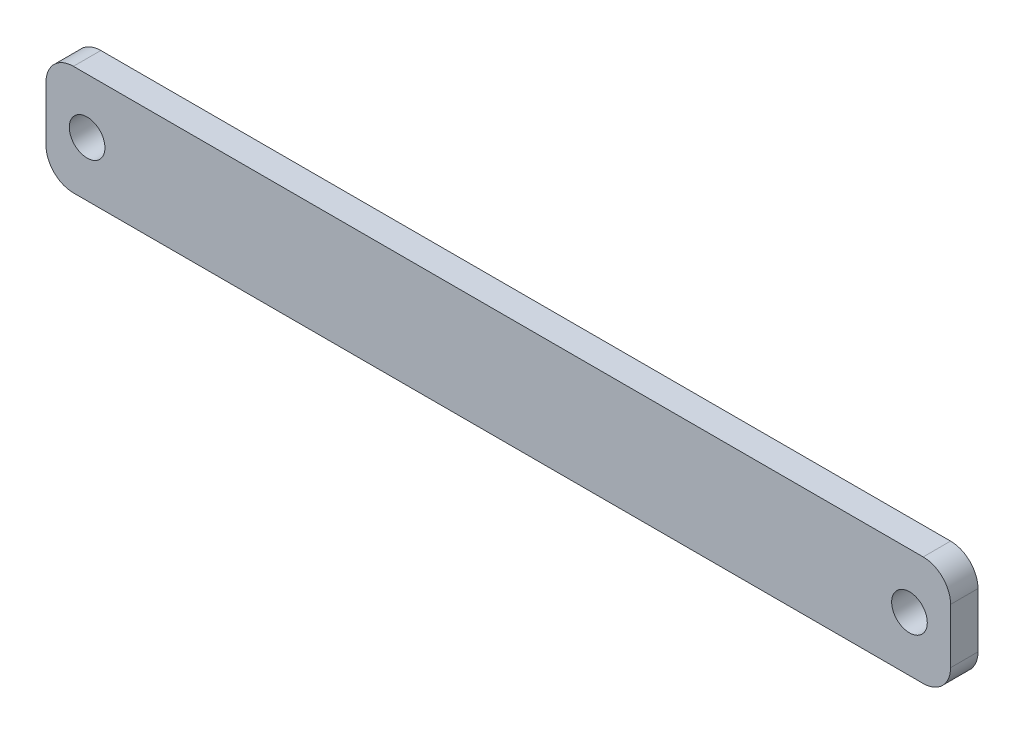
ISO-10303-21;
HEADER;
FILE_DESCRIPTION(('STEP AP214'),'2;1');
FILE_NAME('part.step','',(''),(''),'','','');
FILE_SCHEMA(('AUTOMOTIVE_DESIGN { 1 0 10303 214 1 1 1 1 }'));
ENDSEC;
DATA;
#1=APPLICATION_CONTEXT('core data for automotive mechanical design processes');
#2=APPLICATION_PROTOCOL_DEFINITION('international standard','automotive_design',2000,#1);
#3=PRODUCT_CONTEXT('',#1,'mechanical');
#4=PRODUCT('Part','Part','',(#3));
#5=PRODUCT_RELATED_PRODUCT_CATEGORY('part','',(#4));
#6=PRODUCT_DEFINITION_FORMATION('','',#4);
#7=PRODUCT_DEFINITION_CONTEXT('part definition',#1,'design');
#8=PRODUCT_DEFINITION('design','',#6,#7);
#9=PRODUCT_DEFINITION_SHAPE('','',#8);
#10=(LENGTH_UNIT() NAMED_UNIT(*) SI_UNIT(.MILLI.,.METRE.));
#11=(NAMED_UNIT(*) PLANE_ANGLE_UNIT() SI_UNIT($,.RADIAN.));
#12=(NAMED_UNIT(*) SI_UNIT($,.STERADIAN.) SOLID_ANGLE_UNIT());
#13=UNCERTAINTY_MEASURE_WITH_UNIT(LENGTH_MEASURE(1.E-05),#10,'distance_accuracy_value','');
#14=(GEOMETRIC_REPRESENTATION_CONTEXT(3) GLOBAL_UNCERTAINTY_ASSIGNED_CONTEXT((#13)) GLOBAL_UNIT_ASSIGNED_CONTEXT((#10,
#11,#12)) REPRESENTATION_CONTEXT('',''));
#15=CARTESIAN_POINT('',(0.,0.,0.));
#16=DIRECTION('',(0.,0.,1.));
#17=DIRECTION('',(1.,0.,0.));
#18=AXIS2_PLACEMENT_3D('',#15,#16,#17);
#19=CARTESIAN_POINT('',(155.,-10.,10.));
#20=DIRECTION('',(0.,0.,1.));
#21=DIRECTION('',(1.,0.,0.));
#22=AXIS2_PLACEMENT_3D('',#19,#20,#21);
#23=PLANE('',#22);
#24=CARTESIAN_POINT('',(-150.,0.,10.));
#25=DIRECTION('',(0.,0.,1.));
#26=DIRECTION('',(1.,0.,0.));
#27=AXIS2_PLACEMENT_3D('',#24,#25,#26);
#28=CIRCLE('',#27,6.50000000000002);
#29=CARTESIAN_POINT('',(-143.5,0.,10.));
#30=VERTEX_POINT('',#29);
#31=EDGE_CURVE('E136',#30,#30,#28,.T.);
#32=ORIENTED_EDGE('',*,*,#31,.F.);
#33=EDGE_LOOP('',(#32));
#34=FACE_BOUND('',#33,.T.);
#35=CARTESIAN_POINT('',(155.,-10.,10.));
#36=DIRECTION('',(0.,0.,1.));
#37=DIRECTION('',(1.,0.,0.));
#38=AXIS2_PLACEMENT_3D('',#35,#36,#37);
#39=CIRCLE('',#38,10.);
#40=CARTESIAN_POINT('',(155.,-20.,10.));
#41=VERTEX_POINT('',#40);
#42=CARTESIAN_POINT('',(165.,-9.99999999999993,10.));
#43=VERTEX_POINT('',#42);
#44=EDGE_CURVE('E147',#41,#43,#39,.T.);
#45=ORIENTED_EDGE('',*,*,#44,.T.);
#46=DIRECTION('',(0.,1.,0.));
#47=VECTOR('',#46,1.);
#48=CARTESIAN_POINT('',(165.,9.99999999999993,10.));
#49=LINE('',#48,#47);
#50=CARTESIAN_POINT('',(165.,9.99999999999993,10.));
#51=VERTEX_POINT('',#50);
#52=EDGE_CURVE('E95',#43,#51,#49,.T.);
#53=ORIENTED_EDGE('',*,*,#52,.T.);
#54=CARTESIAN_POINT('',(155.,10.,10.));
#55=DIRECTION('',(0.,0.,1.));
#56=DIRECTION('',(-1.,0.,0.));
#57=AXIS2_PLACEMENT_3D('',#54,#55,#56);
#58=CIRCLE('',#57,10.);
#59=CARTESIAN_POINT('',(155.,20.,10.));
#60=VERTEX_POINT('',#59);
#61=EDGE_CURVE('E162',#51,#60,#58,.T.);
#62=ORIENTED_EDGE('',*,*,#61,.T.);
#63=DIRECTION('',(-1.,0.,0.));
#64=VECTOR('',#63,1.);
#65=CARTESIAN_POINT('',(-155.,20.,10.));
#66=LINE('',#65,#64);
#67=CARTESIAN_POINT('',(-155.,20.,10.));
#68=VERTEX_POINT('',#67);
#69=EDGE_CURVE('E175',#60,#68,#66,.T.);
#70=ORIENTED_EDGE('',*,*,#69,.T.);
#71=CARTESIAN_POINT('',(-155.,10.,10.));
#72=DIRECTION('',(0.,0.,1.));
#73=DIRECTION('',(1.,0.,0.));
#74=AXIS2_PLACEMENT_3D('',#71,#72,#73);
#75=CIRCLE('',#74,10.);
#76=CARTESIAN_POINT('',(-165.,9.99999999999993,10.));
#77=VERTEX_POINT('',#76);
#78=EDGE_CURVE('E114',#68,#77,#75,.T.);
#79=ORIENTED_EDGE('',*,*,#78,.T.);
#80=DIRECTION('',(0.,-1.,0.));
#81=VECTOR('',#80,1.);
#82=CARTESIAN_POINT('',(-165.,9.99999999999993,10.));
#83=LINE('',#82,#81);
#84=CARTESIAN_POINT('',(-165.,-9.99999999999993,10.));
#85=VERTEX_POINT('',#84);
#86=EDGE_CURVE('E108',#77,#85,#83,.T.);
#87=ORIENTED_EDGE('',*,*,#86,.T.);
#88=CARTESIAN_POINT('',(-155.,-10.,10.));
#89=DIRECTION('',(0.,0.,1.));
#90=DIRECTION('',(1.,0.,0.));
#91=AXIS2_PLACEMENT_3D('',#88,#89,#90);
#92=CIRCLE('',#91,10.);
#93=CARTESIAN_POINT('',(-155.,-20.,10.));
#94=VERTEX_POINT('',#93);
#95=EDGE_CURVE('E112',#85,#94,#92,.T.);
#96=ORIENTED_EDGE('',*,*,#95,.T.);
#97=DIRECTION('',(1.,0.,0.));
#98=VECTOR('',#97,1.);
#99=CARTESIAN_POINT('',(-155.,-20.,10.));
#100=LINE('',#99,#98);
#101=EDGE_CURVE('E52',#94,#41,#100,.T.);
#102=ORIENTED_EDGE('',*,*,#101,.T.);
#103=EDGE_LOOP('',(#45,#53,#62,#70,#79,#87,#96,#102));
#104=FACE_BOUND('',#103,.T.);
#105=CARTESIAN_POINT('',(150.,0.,10.));
#106=DIRECTION('',(0.,0.,1.));
#107=DIRECTION('',(1.,0.,0.));
#108=AXIS2_PLACEMENT_3D('',#105,#106,#107);
#109=CIRCLE('',#108,6.50000000000002);
#110=CARTESIAN_POINT('',(156.5,0.,10.));
#111=VERTEX_POINT('',#110);
#112=EDGE_CURVE('E184',#111,#111,#109,.T.);
#113=ORIENTED_EDGE('',*,*,#112,.F.);
#114=EDGE_LOOP('',(#113));
#115=FACE_BOUND('',#114,.T.);
#116=ADVANCED_FACE('F35',(#34,#104,#115),#23,.T.);
#117=CARTESIAN_POINT('',(155.,-10.,0.));
#118=DIRECTION('',(0.,0.,1.));
#119=DIRECTION('',(1.,0.,0.));
#120=AXIS2_PLACEMENT_3D('',#117,#118,#119);
#121=PLANE('',#120);
#122=CARTESIAN_POINT('',(155.,-10.,0.));
#123=DIRECTION('',(0.,0.,1.));
#124=DIRECTION('',(1.,0.,0.));
#125=AXIS2_PLACEMENT_3D('',#122,#123,#124);
#126=CIRCLE('',#125,10.);
#127=CARTESIAN_POINT('',(155.,-20.,0.));
#128=VERTEX_POINT('',#127);
#129=CARTESIAN_POINT('',(165.,-9.99999999999993,0.));
#130=VERTEX_POINT('',#129);
#131=EDGE_CURVE('E132',#128,#130,#126,.T.);
#132=ORIENTED_EDGE('',*,*,#131,.F.);
#133=DIRECTION('',(1.,0.,0.));
#134=VECTOR('',#133,1.);
#135=CARTESIAN_POINT('',(-155.,-20.,0.));
#136=LINE('',#135,#134);
#137=CARTESIAN_POINT('',(-155.,-20.,0.));
#138=VERTEX_POINT('',#137);
#139=EDGE_CURVE('E87',#138,#128,#136,.T.);
#140=ORIENTED_EDGE('',*,*,#139,.F.);
#141=CARTESIAN_POINT('',(-155.,-10.,0.));
#142=DIRECTION('',(0.,0.,1.));
#143=DIRECTION('',(1.,0.,0.));
#144=AXIS2_PLACEMENT_3D('',#141,#142,#143);
#145=CIRCLE('',#144,10.);
#146=CARTESIAN_POINT('',(-165.,-9.99999999999993,0.));
#147=VERTEX_POINT('',#146);
#148=EDGE_CURVE('E81',#147,#138,#145,.T.);
#149=ORIENTED_EDGE('',*,*,#148,.F.);
#150=DIRECTION('',(0.,-1.,0.));
#151=VECTOR('',#150,1.);
#152=CARTESIAN_POINT('',(-165.,9.99999999999993,0.));
#153=LINE('',#152,#151);
#154=CARTESIAN_POINT('',(-165.,9.99999999999993,0.));
#155=VERTEX_POINT('',#154);
#156=EDGE_CURVE('E122',#155,#147,#153,.T.);
#157=ORIENTED_EDGE('',*,*,#156,.F.);
#158=CARTESIAN_POINT('',(-155.,10.,0.));
#159=DIRECTION('',(0.,0.,1.));
#160=DIRECTION('',(1.,0.,0.));
#161=AXIS2_PLACEMENT_3D('',#158,#159,#160);
#162=CIRCLE('',#161,10.);
#163=CARTESIAN_POINT('',(-155.,20.,0.));
#164=VERTEX_POINT('',#163);
#165=EDGE_CURVE('E142',#164,#155,#162,.T.);
#166=ORIENTED_EDGE('',*,*,#165,.F.);
#167=DIRECTION('',(-1.,0.,0.));
#168=VECTOR('',#167,1.);
#169=CARTESIAN_POINT('',(-155.,20.,0.));
#170=LINE('',#169,#168);
#171=CARTESIAN_POINT('',(155.,20.,0.));
#172=VERTEX_POINT('',#171);
#173=EDGE_CURVE('E140',#172,#164,#170,.T.);
#174=ORIENTED_EDGE('',*,*,#173,.F.);
#175=CARTESIAN_POINT('',(155.,10.,0.));
#176=DIRECTION('',(0.,0.,1.));
#177=DIRECTION('',(-1.,0.,0.));
#178=AXIS2_PLACEMENT_3D('',#175,#176,#177);
#179=CIRCLE('',#178,10.);
#180=CARTESIAN_POINT('',(165.,9.99999999999993,0.));
#181=VERTEX_POINT('',#180);
#182=EDGE_CURVE('E138',#181,#172,#179,.T.);
#183=ORIENTED_EDGE('',*,*,#182,.F.);
#184=DIRECTION('',(0.,1.,0.));
#185=VECTOR('',#184,1.);
#186=CARTESIAN_POINT('',(165.,9.99999999999993,0.));
#187=LINE('',#186,#185);
#188=EDGE_CURVE('E135',#130,#181,#187,.T.);
#189=ORIENTED_EDGE('',*,*,#188,.F.);
#190=EDGE_LOOP('',(#132,#140,#149,#157,#166,#174,#183,#189));
#191=FACE_BOUND('',#190,.T.);
#192=CARTESIAN_POINT('',(-150.,0.,0.));
#193=DIRECTION('',(0.,0.,1.));
#194=DIRECTION('',(1.,0.,0.));
#195=AXIS2_PLACEMENT_3D('',#192,#193,#194);
#196=CIRCLE('',#195,6.50000000000002);
#197=CARTESIAN_POINT('',(-143.5,0.,0.));
#198=VERTEX_POINT('',#197);
#199=EDGE_CURVE('E181',#198,#198,#196,.T.);
#200=ORIENTED_EDGE('',*,*,#199,.T.);
#201=EDGE_LOOP('',(#200));
#202=FACE_BOUND('',#201,.T.);
#203=CARTESIAN_POINT('',(150.,0.,0.));
#204=DIRECTION('',(0.,0.,1.));
#205=DIRECTION('',(1.,0.,0.));
#206=AXIS2_PLACEMENT_3D('',#203,#204,#205);
#207=CIRCLE('',#206,6.50000000000002);
#208=CARTESIAN_POINT('',(156.5,0.,0.));
#209=VERTEX_POINT('',#208);
#210=EDGE_CURVE('E187',#209,#209,#207,.T.);
#211=ORIENTED_EDGE('',*,*,#210,.T.);
#212=EDGE_LOOP('',(#211));
#213=FACE_BOUND('',#212,.T.);
#214=ADVANCED_FACE('F166',(#191,#202,#213),#121,.F.);
#215=CARTESIAN_POINT('',(155.,-10.,10.));
#216=DIRECTION('',(0.,0.,-1.));
#217=DIRECTION('',(-1.,0.,0.));
#218=AXIS2_PLACEMENT_3D('',#215,#216,#217);
#219=CYLINDRICAL_SURFACE('',#218,10.);
#220=ORIENTED_EDGE('',*,*,#131,.T.);
#221=DIRECTION('',(0.,0.,-1.));
#222=VECTOR('',#221,1.);
#223=CARTESIAN_POINT('',(165.,-9.99999999999993,10.));
#224=LINE('',#223,#222);
#225=EDGE_CURVE('E11',#43,#130,#224,.T.);
#226=ORIENTED_EDGE('',*,*,#225,.F.);
#227=ORIENTED_EDGE('',*,*,#44,.F.);
#228=DIRECTION('',(0.,0.,-1.));
#229=VECTOR('',#228,1.);
#230=CARTESIAN_POINT('',(155.,-20.,10.));
#231=LINE('',#230,#229);
#232=EDGE_CURVE('E128',#41,#128,#231,.T.);
#233=ORIENTED_EDGE('',*,*,#232,.T.);
#234=EDGE_LOOP('',(#220,#226,#227,#233));
#235=FACE_BOUND('',#234,.T.);
#236=ADVANCED_FACE('F37',(#235),#219,.T.);
#237=CARTESIAN_POINT('',(165.,9.99999999999993,10.));
#238=DIRECTION('',(-1.,0.,0.));
#239=DIRECTION('',(0.,0.,1.));
#240=AXIS2_PLACEMENT_3D('',#237,#238,#239);
#241=PLANE('',#240);
#242=ORIENTED_EDGE('',*,*,#188,.T.);
#243=DIRECTION('',(0.,0.,-1.));
#244=VECTOR('',#243,1.);
#245=CARTESIAN_POINT('',(165.,9.99999999999993,10.));
#246=LINE('',#245,#244);
#247=EDGE_CURVE('E44',#51,#181,#246,.T.);
#248=ORIENTED_EDGE('',*,*,#247,.F.);
#249=ORIENTED_EDGE('',*,*,#52,.F.);
#250=ORIENTED_EDGE('',*,*,#225,.T.);
#251=EDGE_LOOP('',(#242,#248,#249,#250));
#252=FACE_BOUND('',#251,.T.);
#253=ADVANCED_FACE('F219',(#252),#241,.F.);
#254=CARTESIAN_POINT('',(155.,10.,10.));
#255=DIRECTION('',(0.,0.,-1.));
#256=DIRECTION('',(-1.,0.,0.));
#257=AXIS2_PLACEMENT_3D('',#254,#255,#256);
#258=CYLINDRICAL_SURFACE('',#257,10.);
#259=ORIENTED_EDGE('',*,*,#182,.T.);
#260=DIRECTION('',(0.,0.,-1.));
#261=VECTOR('',#260,1.);
#262=CARTESIAN_POINT('',(155.,20.,10.));
#263=LINE('',#262,#261);
#264=EDGE_CURVE('E154',#60,#172,#263,.T.);
#265=ORIENTED_EDGE('',*,*,#264,.F.);
#266=ORIENTED_EDGE('',*,*,#61,.F.);
#267=ORIENTED_EDGE('',*,*,#247,.T.);
#268=EDGE_LOOP('',(#259,#265,#266,#267));
#269=FACE_BOUND('',#268,.T.);
#270=ADVANCED_FACE('F160',(#269),#258,.T.);
#271=CARTESIAN_POINT('',(-155.,20.,10.));
#272=DIRECTION('',(0.,-1.,0.));
#273=DIRECTION('',(0.,0.,-1.));
#274=AXIS2_PLACEMENT_3D('',#271,#272,#273);
#275=PLANE('',#274);
#276=ORIENTED_EDGE('',*,*,#173,.T.);
#277=DIRECTION('',(0.,0.,-1.));
#278=VECTOR('',#277,1.);
#279=CARTESIAN_POINT('',(-155.,20.,10.));
#280=LINE('',#279,#278);
#281=EDGE_CURVE('E151',#68,#164,#280,.T.);
#282=ORIENTED_EDGE('',*,*,#281,.F.);
#283=ORIENTED_EDGE('',*,*,#69,.F.);
#284=ORIENTED_EDGE('',*,*,#264,.T.);
#285=EDGE_LOOP('',(#276,#282,#283,#284));
#286=FACE_BOUND('',#285,.T.);
#287=ADVANCED_FACE('F171',(#286),#275,.F.);
#288=CARTESIAN_POINT('',(-155.,10.,10.));
#289=DIRECTION('',(0.,0.,-1.));
#290=DIRECTION('',(-1.,0.,0.));
#291=AXIS2_PLACEMENT_3D('',#288,#289,#290);
#292=CYLINDRICAL_SURFACE('',#291,10.);
#293=ORIENTED_EDGE('',*,*,#165,.T.);
#294=DIRECTION('',(0.,0.,-1.));
#295=VECTOR('',#294,1.);
#296=CARTESIAN_POINT('',(-165.,9.99999999999993,10.));
#297=LINE('',#296,#295);
#298=EDGE_CURVE('E123',#77,#155,#297,.T.);
#299=ORIENTED_EDGE('',*,*,#298,.F.);
#300=ORIENTED_EDGE('',*,*,#78,.F.);
#301=ORIENTED_EDGE('',*,*,#281,.T.);
#302=EDGE_LOOP('',(#293,#299,#300,#301));
#303=FACE_BOUND('',#302,.T.);
#304=ADVANCED_FACE('F174',(#303),#292,.T.);
#305=CARTESIAN_POINT('',(-165.,9.99999999999993,10.));
#306=DIRECTION('',(1.,0.,0.));
#307=DIRECTION('',(0.,0.,-1.));
#308=AXIS2_PLACEMENT_3D('',#305,#306,#307);
#309=PLANE('',#308);
#310=ORIENTED_EDGE('',*,*,#156,.T.);
#311=DIRECTION('',(0.,0.,-1.));
#312=VECTOR('',#311,1.);
#313=CARTESIAN_POINT('',(-165.,-9.99999999999993,10.));
#314=LINE('',#313,#312);
#315=EDGE_CURVE('E119',#85,#147,#314,.T.);
#316=ORIENTED_EDGE('',*,*,#315,.F.);
#317=ORIENTED_EDGE('',*,*,#86,.F.);
#318=ORIENTED_EDGE('',*,*,#298,.T.);
#319=EDGE_LOOP('',(#310,#316,#317,#318));
#320=FACE_BOUND('',#319,.T.);
#321=ADVANCED_FACE('F120',(#320),#309,.F.);
#322=CARTESIAN_POINT('',(-155.,-10.,10.));
#323=DIRECTION('',(0.,0.,-1.));
#324=DIRECTION('',(-1.,0.,0.));
#325=AXIS2_PLACEMENT_3D('',#322,#323,#324);
#326=CYLINDRICAL_SURFACE('',#325,10.);
#327=ORIENTED_EDGE('',*,*,#148,.T.);
#328=DIRECTION('',(0.,0.,-1.));
#329=VECTOR('',#328,1.);
#330=CARTESIAN_POINT('',(-155.,-20.,10.));
#331=LINE('',#330,#329);
#332=EDGE_CURVE('E124',#94,#138,#331,.T.);
#333=ORIENTED_EDGE('',*,*,#332,.F.);
#334=ORIENTED_EDGE('',*,*,#95,.F.);
#335=ORIENTED_EDGE('',*,*,#315,.T.);
#336=EDGE_LOOP('',(#327,#333,#334,#335));
#337=FACE_BOUND('',#336,.T.);
#338=ADVANCED_FACE('F126',(#337),#326,.T.);
#339=CARTESIAN_POINT('',(-155.,-20.,10.));
#340=DIRECTION('',(0.,1.,0.));
#341=DIRECTION('',(0.,0.,1.));
#342=AXIS2_PLACEMENT_3D('',#339,#340,#341);
#343=PLANE('',#342);
#344=ORIENTED_EDGE('',*,*,#139,.T.);
#345=ORIENTED_EDGE('',*,*,#232,.F.);
#346=ORIENTED_EDGE('',*,*,#101,.F.);
#347=ORIENTED_EDGE('',*,*,#332,.T.);
#348=EDGE_LOOP('',(#344,#345,#346,#347));
#349=FACE_BOUND('',#348,.T.);
#350=ADVANCED_FACE('F207',(#349),#343,.F.);
#351=CARTESIAN_POINT('',(-150.,0.,10.));
#352=DIRECTION('',(0.,0.,-1.));
#353=DIRECTION('',(-1.,0.,0.));
#354=AXIS2_PLACEMENT_3D('',#351,#352,#353);
#355=CYLINDRICAL_SURFACE('',#354,6.50000000000002);
#356=ORIENTED_EDGE('',*,*,#31,.T.);
#357=EDGE_LOOP('',(#356));
#358=FACE_BOUND('',#357,.T.);
#359=ORIENTED_EDGE('',*,*,#199,.F.);
#360=EDGE_LOOP('',(#359));
#361=FACE_BOUND('',#360,.T.);
#362=ADVANCED_FACE('F204',(#358,#361),#355,.F.);
#363=CARTESIAN_POINT('',(150.,0.,10.));
#364=DIRECTION('',(0.,0.,-1.));
#365=DIRECTION('',(-1.,0.,0.));
#366=AXIS2_PLACEMENT_3D('',#363,#364,#365);
#367=CYLINDRICAL_SURFACE('',#366,6.50000000000002);
#368=ORIENTED_EDGE('',*,*,#112,.T.);
#369=EDGE_LOOP('',(#368));
#370=FACE_BOUND('',#369,.T.);
#371=ORIENTED_EDGE('',*,*,#210,.F.);
#372=EDGE_LOOP('',(#371));
#373=FACE_BOUND('',#372,.T.);
#374=ADVANCED_FACE('F193',(#370,#373),#367,.F.);
#375=CLOSED_SHELL('',(#116,#214,#236,#253,#270,#287,#304,#321,#338,#350,#362,#374));
#376=MANIFOLD_SOLID_BREP('B2',#375);
#377=ADVANCED_BREP_SHAPE_REPRESENTATION('',(#18,#376),#14);
#378=SHAPE_DEFINITION_REPRESENTATION(#9,#377);
ENDSEC;
END-ISO-10303-21;
